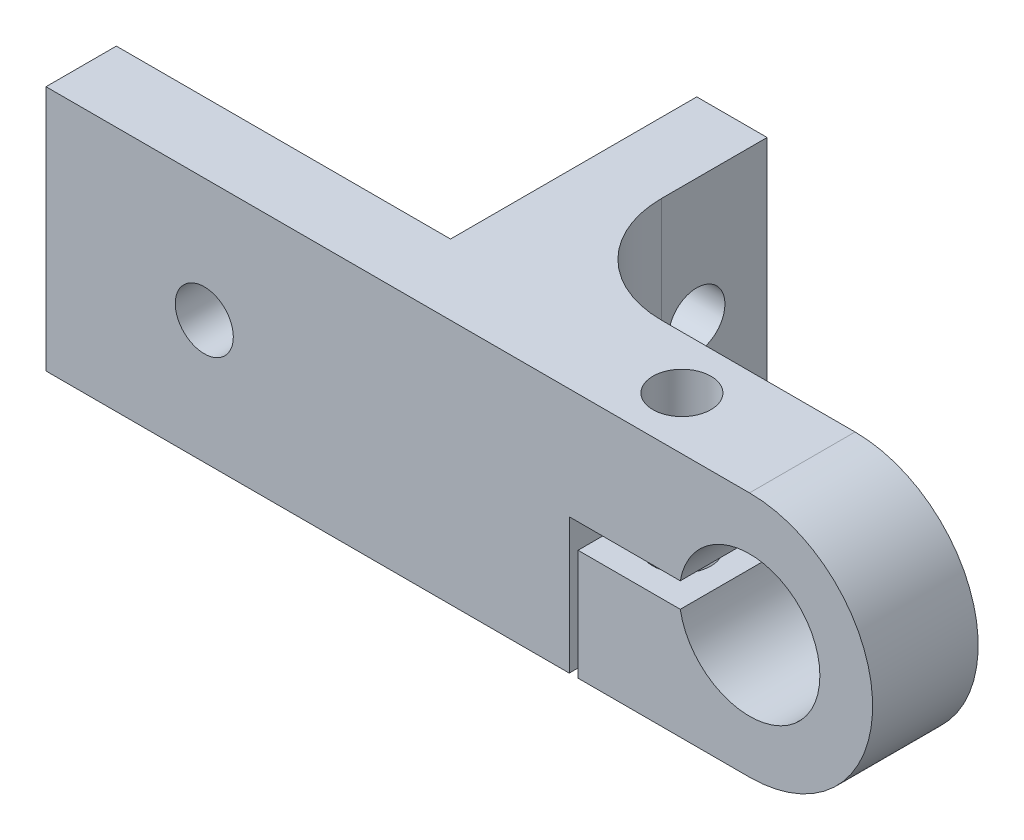
ISO-10303-21;
HEADER;
FILE_DESCRIPTION(('STEP AP214'),'2;1');
FILE_NAME('part.step','',(''),(''),'','','');
FILE_SCHEMA(('AUTOMOTIVE_DESIGN { 1 0 10303 214 1 1 1 1 }'));
ENDSEC;
DATA;
#1=APPLICATION_CONTEXT('core data for automotive mechanical design processes');
#2=APPLICATION_PROTOCOL_DEFINITION('international standard','automotive_design',2000,#1);
#3=PRODUCT_CONTEXT('',#1,'mechanical');
#4=PRODUCT('Part','Part','',(#3));
#5=PRODUCT_RELATED_PRODUCT_CATEGORY('part','',(#4));
#6=PRODUCT_DEFINITION_FORMATION('','',#4);
#7=PRODUCT_DEFINITION_CONTEXT('part definition',#1,'design');
#8=PRODUCT_DEFINITION('design','',#6,#7);
#9=PRODUCT_DEFINITION_SHAPE('','',#8);
#10=(LENGTH_UNIT() NAMED_UNIT(*) SI_UNIT(.MILLI.,.METRE.));
#11=(NAMED_UNIT(*) PLANE_ANGLE_UNIT() SI_UNIT($,.RADIAN.));
#12=(NAMED_UNIT(*) SI_UNIT($,.STERADIAN.) SOLID_ANGLE_UNIT());
#13=UNCERTAINTY_MEASURE_WITH_UNIT(LENGTH_MEASURE(1.E-05),#10,'distance_accuracy_value','');
#14=(GEOMETRIC_REPRESENTATION_CONTEXT(3) GLOBAL_UNCERTAINTY_ASSIGNED_CONTEXT((#13)) GLOBAL_UNIT_ASSIGNED_CONTEXT((#10,
#11,#12)) REPRESENTATION_CONTEXT('',''));
#15=CARTESIAN_POINT('',(0.,0.,0.));
#16=DIRECTION('',(0.,0.,1.));
#17=DIRECTION('',(1.,0.,0.));
#18=AXIS2_PLACEMENT_3D('',#15,#16,#17);
#19=CARTESIAN_POINT('',(0.,0.,18.));
#20=DIRECTION('',(0.,0.,1.));
#21=DIRECTION('',(1.,0.,0.));
#22=AXIS2_PLACEMENT_3D('',#19,#20,#21);
#23=PLANE('',#22);
#24=CARTESIAN_POINT('',(0.,0.,18.));
#25=DIRECTION('',(0.,0.,1.));
#26=DIRECTION('',(1.,0.,0.));
#27=AXIS2_PLACEMENT_3D('',#24,#25,#26);
#28=CIRCLE('',#27,7.);
#29=CARTESIAN_POINT('',(0.,-7.,18.));
#30=VERTEX_POINT('',#29);
#31=CARTESIAN_POINT('',(0.,7.,18.));
#32=VERTEX_POINT('',#31);
#33=EDGE_CURVE('E143',#30,#32,#28,.T.);
#34=ORIENTED_EDGE('',*,*,#33,.T.);
#35=DIRECTION('',(-1.,0.,0.));
#36=VECTOR('',#35,1.);
#37=CARTESIAN_POINT('',(0.,7.,18.));
#38=LINE('',#37,#36);
#39=CARTESIAN_POINT('',(-40.,7.,18.));
#40=VERTEX_POINT('',#39);
#41=EDGE_CURVE('E171',#32,#40,#38,.T.);
#42=ORIENTED_EDGE('',*,*,#41,.T.);
#43=DIRECTION('',(0.,-1.,0.));
#44=VECTOR('',#43,1.);
#45=CARTESIAN_POINT('',(-40.,7.,18.));
#46=LINE('',#45,#44);
#47=CARTESIAN_POINT('',(-40.,-7.,18.));
#48=VERTEX_POINT('',#47);
#49=EDGE_CURVE('E168',#40,#48,#46,.T.);
#50=ORIENTED_EDGE('',*,*,#49,.T.);
#51=DIRECTION('',(1.,0.,0.));
#52=VECTOR('',#51,1.);
#53=CARTESIAN_POINT('',(-40.,-7.,18.));
#54=LINE('',#53,#52);
#55=CARTESIAN_POINT('',(-10.25,-7.,18.));
#56=VERTEX_POINT('',#55);
#57=EDGE_CURVE('E165',#48,#56,#54,.T.);
#58=ORIENTED_EDGE('',*,*,#57,.T.);
#59=DIRECTION('',(0.,1.,0.));
#60=VECTOR('',#59,1.);
#61=CARTESIAN_POINT('',(-10.25,0.699999999999999,18.));
#62=LINE('',#61,#60);
#63=CARTESIAN_POINT('',(-10.25,0.699999999999999,18.));
#64=VERTEX_POINT('',#63);
#65=EDGE_CURVE('E162',#56,#64,#62,.T.);
#66=ORIENTED_EDGE('',*,*,#65,.T.);
#67=DIRECTION('',(1.,0.,0.));
#68=VECTOR('',#67,1.);
#69=CARTESIAN_POINT('',(-3.93827373350304,0.7,18.));
#70=LINE('',#69,#68);
#71=CARTESIAN_POINT('',(-3.93827373350304,0.7,18.));
#72=VERTEX_POINT('',#71);
#73=EDGE_CURVE('E159',#64,#72,#70,.T.);
#74=ORIENTED_EDGE('',*,*,#73,.T.);
#75=CARTESIAN_POINT('',(0.,0.,18.));
#76=DIRECTION('',(0.,0.,-1.));
#77=DIRECTION('',(1.,0.,0.));
#78=AXIS2_PLACEMENT_3D('',#75,#76,#77);
#79=CIRCLE('',#78,4.);
#80=CARTESIAN_POINT('',(-3.93827373350304,-0.7,18.));
#81=VERTEX_POINT('',#80);
#82=EDGE_CURVE('E156',#72,#81,#79,.T.);
#83=ORIENTED_EDGE('',*,*,#82,.T.);
#84=DIRECTION('',(-1.,0.,0.));
#85=VECTOR('',#84,1.);
#86=CARTESIAN_POINT('',(-3.93827373350304,-0.7,18.));
#87=LINE('',#86,#85);
#88=CARTESIAN_POINT('',(-9.75,-0.700000000000001,18.));
#89=VERTEX_POINT('',#88);
#90=EDGE_CURVE('E153',#81,#89,#87,.T.);
#91=ORIENTED_EDGE('',*,*,#90,.T.);
#92=DIRECTION('',(0.,-1.,0.));
#93=VECTOR('',#92,1.);
#94=CARTESIAN_POINT('',(-9.75,-0.700000000000001,18.));
#95=LINE('',#94,#93);
#96=CARTESIAN_POINT('',(-9.75,-7.,18.));
#97=VERTEX_POINT('',#96);
#98=EDGE_CURVE('E150',#89,#97,#95,.T.);
#99=ORIENTED_EDGE('',*,*,#98,.T.);
#100=DIRECTION('',(1.,0.,0.));
#101=VECTOR('',#100,1.);
#102=CARTESIAN_POINT('',(-9.75,-7.,18.));
#103=LINE('',#102,#101);
#104=EDGE_CURVE('E140',#97,#30,#103,.T.);
#105=ORIENTED_EDGE('',*,*,#104,.T.);
#106=EDGE_LOOP('',(#34,#42,#50,#58,#66,#74,#83,#91,#99,#105));
#107=FACE_BOUND('',#106,.T.);
#108=CARTESIAN_POINT('',(-31.,0.,18.));
#109=DIRECTION('',(0.,0.,1.));
#110=DIRECTION('',(1.,0.,0.));
#111=AXIS2_PLACEMENT_3D('',#108,#109,#110);
#112=CIRCLE('',#111,1.65);
#113=CARTESIAN_POINT('',(-29.35,0.,18.));
#114=VERTEX_POINT('',#113);
#115=EDGE_CURVE('E147',#114,#114,#112,.T.);
#116=ORIENTED_EDGE('',*,*,#115,.F.);
#117=EDGE_LOOP('',(#116));
#118=FACE_BOUND('',#117,.T.);
#119=ADVANCED_FACE('F32',(#107,#118),#23,.T.);
#120=CARTESIAN_POINT('',(0.,0.,0.));
#121=DIRECTION('',(0.,0.,1.));
#122=DIRECTION('',(1.,0.,0.));
#123=AXIS2_PLACEMENT_3D('',#120,#121,#122);
#124=PLANE('',#123);
#125=DIRECTION('',(-1.,0.,0.));
#126=VECTOR('',#125,1.);
#127=CARTESIAN_POINT('',(0.,7.,0.));
#128=LINE('',#127,#126);
#129=CARTESIAN_POINT('',(-17.,7.,0.));
#130=VERTEX_POINT('',#129);
#131=CARTESIAN_POINT('',(-21.,7.,0.));
#132=VERTEX_POINT('',#131);
#133=EDGE_CURVE('E144',#130,#132,#128,.T.);
#134=ORIENTED_EDGE('',*,*,#133,.F.);
#135=DIRECTION('',(0.,-1.,0.));
#136=VECTOR('',#135,1.);
#137=CARTESIAN_POINT('',(-17.,7.,0.));
#138=LINE('',#137,#136);
#139=CARTESIAN_POINT('',(-17.,-7.,0.));
#140=VERTEX_POINT('',#139);
#141=EDGE_CURVE('E103',#130,#140,#138,.T.);
#142=ORIENTED_EDGE('',*,*,#141,.T.);
#143=DIRECTION('',(1.,0.,0.));
#144=VECTOR('',#143,1.);
#145=CARTESIAN_POINT('',(-40.,-7.,0.));
#146=LINE('',#145,#144);
#147=CARTESIAN_POINT('',(-21.,-7.,0.));
#148=VERTEX_POINT('',#147);
#149=EDGE_CURVE('E141',#148,#140,#146,.T.);
#150=ORIENTED_EDGE('',*,*,#149,.F.);
#151=DIRECTION('',(0.,-1.,0.));
#152=VECTOR('',#151,1.);
#153=CARTESIAN_POINT('',(-21.,7.,0.));
#154=LINE('',#153,#152);
#155=EDGE_CURVE('E180',#132,#148,#154,.T.);
#156=ORIENTED_EDGE('',*,*,#155,.F.);
#157=EDGE_LOOP('',(#134,#142,#150,#156));
#158=FACE_BOUND('',#157,.T.);
#159=ADVANCED_FACE('F244',(#158),#124,.F.);
#160=CARTESIAN_POINT('',(0.,0.,18.));
#161=DIRECTION('',(0.,0.,-1.));
#162=DIRECTION('',(-1.,0.,0.));
#163=AXIS2_PLACEMENT_3D('',#160,#161,#162);
#164=CYLINDRICAL_SURFACE('',#163,7.);
#165=CARTESIAN_POINT('',(0.,0.,12.));
#166=DIRECTION('',(0.,0.,1.));
#167=DIRECTION('',(1.,0.,0.));
#168=AXIS2_PLACEMENT_3D('',#165,#166,#167);
#169=CIRCLE('',#168,7.);
#170=CARTESIAN_POINT('',(0.,-7.,12.));
#171=VERTEX_POINT('',#170);
#172=CARTESIAN_POINT('',(0.,7.,12.));
#173=VERTEX_POINT('',#172);
#174=EDGE_CURVE('E51',#171,#173,#169,.T.);
#175=ORIENTED_EDGE('',*,*,#174,.T.);
#176=DIRECTION('',(0.,0.,-1.));
#177=VECTOR('',#176,1.);
#178=CARTESIAN_POINT('',(0.,7.,18.));
#179=LINE('',#178,#177);
#180=EDGE_CURVE('E106',#32,#173,#179,.T.);
#181=ORIENTED_EDGE('',*,*,#180,.F.);
#182=ORIENTED_EDGE('',*,*,#33,.F.);
#183=DIRECTION('',(0.,0.,-1.));
#184=VECTOR('',#183,1.);
#185=CARTESIAN_POINT('',(0.,-7.,18.));
#186=LINE('',#185,#184);
#187=EDGE_CURVE('E137',#30,#171,#186,.T.);
#188=ORIENTED_EDGE('',*,*,#187,.T.);
#189=EDGE_LOOP('',(#175,#181,#182,#188));
#190=FACE_BOUND('',#189,.T.);
#191=ADVANCED_FACE('F34',(#190),#164,.T.);
#192=CARTESIAN_POINT('',(0.,7.,18.));
#193=DIRECTION('',(0.,-1.,0.));
#194=DIRECTION('',(0.,0.,-1.));
#195=AXIS2_PLACEMENT_3D('',#192,#193,#194);
#196=PLANE('',#195);
#197=CARTESIAN_POINT('',(-6.84413686675152,7.,15.));
#198=DIRECTION('',(0.,-1.,0.));
#199=DIRECTION('',(0.,0.,-1.));
#200=AXIS2_PLACEMENT_3D('',#197,#198,#199);
#201=CIRCLE('',#200,1.65);
#202=CARTESIAN_POINT('',(-6.84413686675152,7.,13.35));
#203=VERTEX_POINT('',#202);
#204=EDGE_CURVE('E212',#203,#203,#201,.T.);
#205=ORIENTED_EDGE('',*,*,#204,.T.);
#206=EDGE_LOOP('',(#205));
#207=FACE_BOUND('',#206,.T.);
#208=CARTESIAN_POINT('',(-11.,7.,6.));
#209=DIRECTION('',(0.,-1.,0.));
#210=DIRECTION('',(0.,0.,1.));
#211=AXIS2_PLACEMENT_3D('',#208,#209,#210);
#212=CIRCLE('',#211,6.);
#213=CARTESIAN_POINT('',(-11.,7.,12.));
#214=VERTEX_POINT('',#213);
#215=CARTESIAN_POINT('',(-17.,7.,5.99999999999999));
#216=VERTEX_POINT('',#215);
#217=EDGE_CURVE('E89',#214,#216,#212,.T.);
#218=ORIENTED_EDGE('',*,*,#217,.T.);
#219=DIRECTION('',(0.,0.,-1.));
#220=VECTOR('',#219,1.);
#221=CARTESIAN_POINT('',(-17.,7.,0.));
#222=LINE('',#221,#220);
#223=EDGE_CURVE('E91',#216,#130,#222,.T.);
#224=ORIENTED_EDGE('',*,*,#223,.T.);
#225=ORIENTED_EDGE('',*,*,#133,.T.);
#226=DIRECTION('',(0.,0.,1.));
#227=VECTOR('',#226,1.);
#228=CARTESIAN_POINT('',(-21.,7.,14.));
#229=LINE('',#228,#227);
#230=CARTESIAN_POINT('',(-21.,7.,14.));
#231=VERTEX_POINT('',#230);
#232=EDGE_CURVE('E190',#132,#231,#229,.T.);
#233=ORIENTED_EDGE('',*,*,#232,.T.);
#234=DIRECTION('',(-1.,0.,0.));
#235=VECTOR('',#234,1.);
#236=CARTESIAN_POINT('',(-40.,7.,14.));
#237=LINE('',#236,#235);
#238=CARTESIAN_POINT('',(-40.,7.,14.));
#239=VERTEX_POINT('',#238);
#240=EDGE_CURVE('E183',#231,#239,#237,.T.);
#241=ORIENTED_EDGE('',*,*,#240,.T.);
#242=DIRECTION('',(0.,0.,-1.));
#243=VECTOR('',#242,1.);
#244=CARTESIAN_POINT('',(-40.,7.,18.));
#245=LINE('',#244,#243);
#246=EDGE_CURVE('E114',#40,#239,#245,.T.);
#247=ORIENTED_EDGE('',*,*,#246,.F.);
#248=ORIENTED_EDGE('',*,*,#41,.F.);
#249=ORIENTED_EDGE('',*,*,#180,.T.);
#250=DIRECTION('',(-1.,0.,0.));
#251=VECTOR('',#250,1.);
#252=CARTESIAN_POINT('',(7.,7.,12.));
#253=LINE('',#252,#251);
#254=EDGE_CURVE('E215',#173,#214,#253,.T.);
#255=ORIENTED_EDGE('',*,*,#254,.T.);
#256=EDGE_LOOP('',(#218,#224,#225,#233,#241,#247,#248,#249,#255));
#257=FACE_BOUND('',#256,.T.);
#258=ADVANCED_FACE('F285',(#207,#257),#196,.F.);
#259=CARTESIAN_POINT('',(-40.,7.,18.));
#260=DIRECTION('',(1.,0.,0.));
#261=DIRECTION('',(0.,0.,-1.));
#262=AXIS2_PLACEMENT_3D('',#259,#260,#261);
#263=PLANE('',#262);
#264=ORIENTED_EDGE('',*,*,#246,.T.);
#265=DIRECTION('',(0.,-1.,0.));
#266=VECTOR('',#265,1.);
#267=CARTESIAN_POINT('',(-40.,7.,14.));
#268=LINE('',#267,#266);
#269=CARTESIAN_POINT('',(-40.,-7.,14.));
#270=VERTEX_POINT('',#269);
#271=EDGE_CURVE('E111',#239,#270,#268,.T.);
#272=ORIENTED_EDGE('',*,*,#271,.T.);
#273=DIRECTION('',(0.,0.,-1.));
#274=VECTOR('',#273,1.);
#275=CARTESIAN_POINT('',(-40.,-7.,18.));
#276=LINE('',#275,#274);
#277=EDGE_CURVE('E117',#48,#270,#276,.T.);
#278=ORIENTED_EDGE('',*,*,#277,.F.);
#279=ORIENTED_EDGE('',*,*,#49,.F.);
#280=EDGE_LOOP('',(#264,#272,#278,#279));
#281=FACE_BOUND('',#280,.T.);
#282=ADVANCED_FACE('F283',(#281),#263,.F.);
#283=CARTESIAN_POINT('',(-40.,-7.,18.));
#284=DIRECTION('',(0.,1.,0.));
#285=DIRECTION('',(0.,0.,1.));
#286=AXIS2_PLACEMENT_3D('',#283,#284,#285);
#287=PLANE('',#286);
#288=ORIENTED_EDGE('',*,*,#149,.T.);
#289=DIRECTION('',(0.,0.,1.));
#290=VECTOR('',#289,1.);
#291=CARTESIAN_POINT('',(-17.,-7.,18.));
#292=LINE('',#291,#290);
#293=CARTESIAN_POINT('',(-17.,-7.,5.99999999999999));
#294=VERTEX_POINT('',#293);
#295=EDGE_CURVE('E11',#140,#294,#292,.T.);
#296=ORIENTED_EDGE('',*,*,#295,.T.);
#297=CARTESIAN_POINT('',(-11.,-7.,6.));
#298=DIRECTION('',(0.,-1.,0.));
#299=DIRECTION('',(0.,0.,-1.));
#300=AXIS2_PLACEMENT_3D('',#297,#298,#299);
#301=CIRCLE('',#300,6.);
#302=CARTESIAN_POINT('',(-11.,-7.,12.));
#303=VERTEX_POINT('',#302);
#304=EDGE_CURVE('E42',#294,#303,#301,.F.);
#305=ORIENTED_EDGE('',*,*,#304,.T.);
#306=DIRECTION('',(1.,0.,0.));
#307=VECTOR('',#306,1.);
#308=CARTESIAN_POINT('',(-40.,-7.,12.));
#309=LINE('',#308,#307);
#310=CARTESIAN_POINT('',(-10.25,-7.,12.));
#311=VERTEX_POINT('',#310);
#312=EDGE_CURVE('E72',#303,#311,#309,.T.);
#313=ORIENTED_EDGE('',*,*,#312,.T.);
#314=DIRECTION('',(0.,0.,-1.));
#315=VECTOR('',#314,1.);
#316=CARTESIAN_POINT('',(-10.25,-7.,18.));
#317=LINE('',#316,#315);
#318=EDGE_CURVE('E120',#56,#311,#317,.T.);
#319=ORIENTED_EDGE('',*,*,#318,.F.);
#320=ORIENTED_EDGE('',*,*,#57,.F.);
#321=ORIENTED_EDGE('',*,*,#277,.T.);
#322=DIRECTION('',(1.,0.,0.));
#323=VECTOR('',#322,1.);
#324=CARTESIAN_POINT('',(-40.,-7.,14.));
#325=LINE('',#324,#323);
#326=CARTESIAN_POINT('',(-21.,-7.,14.));
#327=VERTEX_POINT('',#326);
#328=EDGE_CURVE('E110',#270,#327,#325,.T.);
#329=ORIENTED_EDGE('',*,*,#328,.T.);
#330=DIRECTION('',(0.,0.,-1.));
#331=VECTOR('',#330,1.);
#332=CARTESIAN_POINT('',(-21.,-7.,18.));
#333=LINE('',#332,#331);
#334=EDGE_CURVE('E96',#327,#148,#333,.T.);
#335=ORIENTED_EDGE('',*,*,#334,.T.);
#336=EDGE_LOOP('',(#288,#296,#305,#313,#319,#320,#321,#329,#335));
#337=FACE_BOUND('',#336,.T.);
#338=ADVANCED_FACE('F94',(#337),#287,.F.);
#339=CARTESIAN_POINT('',(-10.25,0.699999999999999,18.));
#340=DIRECTION('',(-1.,0.,0.));
#341=DIRECTION('',(0.,-1.,0.));
#342=AXIS2_PLACEMENT_3D('',#339,#340,#341);
#343=PLANE('',#342);
#344=ORIENTED_EDGE('',*,*,#318,.T.);
#345=DIRECTION('',(0.,1.,0.));
#346=VECTOR('',#345,1.);
#347=CARTESIAN_POINT('',(-10.25,0.699999999999999,12.));
#348=LINE('',#347,#346);
#349=CARTESIAN_POINT('',(-10.25,0.699999999999999,12.));
#350=VERTEX_POINT('',#349);
#351=EDGE_CURVE('E80',#311,#350,#348,.T.);
#352=ORIENTED_EDGE('',*,*,#351,.T.);
#353=DIRECTION('',(0.,0.,-1.));
#354=VECTOR('',#353,1.);
#355=CARTESIAN_POINT('',(-10.25,0.699999999999999,18.));
#356=LINE('',#355,#354);
#357=EDGE_CURVE('E122',#64,#350,#356,.T.);
#358=ORIENTED_EDGE('',*,*,#357,.F.);
#359=ORIENTED_EDGE('',*,*,#65,.F.);
#360=EDGE_LOOP('',(#344,#352,#358,#359));
#361=FACE_BOUND('',#360,.T.);
#362=ADVANCED_FACE('F276',(#361),#343,.F.);
#363=CARTESIAN_POINT('',(-3.93827373350304,0.7,18.));
#364=DIRECTION('',(0.,1.,0.));
#365=DIRECTION('',(-1.,0.,0.));
#366=AXIS2_PLACEMENT_3D('',#363,#364,#365);
#367=PLANE('',#366);
#368=CARTESIAN_POINT('',(-6.84413686675152,0.7,15.));
#369=DIRECTION('',(0.,1.,0.));
#370=DIRECTION('',(-1.,0.,0.));
#371=AXIS2_PLACEMENT_3D('',#368,#369,#370);
#372=CIRCLE('',#371,1.65);
#373=CARTESIAN_POINT('',(-8.49413686675152,0.7,15.));
#374=VERTEX_POINT('',#373);
#375=EDGE_CURVE('E207',#374,#374,#372,.T.);
#376=ORIENTED_EDGE('',*,*,#375,.T.);
#377=EDGE_LOOP('',(#376));
#378=FACE_BOUND('',#377,.T.);
#379=ORIENTED_EDGE('',*,*,#357,.T.);
#380=DIRECTION('',(1.,0.,0.));
#381=VECTOR('',#380,1.);
#382=CARTESIAN_POINT('',(-3.93827373350304,0.7,12.));
#383=LINE('',#382,#381);
#384=CARTESIAN_POINT('',(-3.93827373350304,0.7,12.));
#385=VERTEX_POINT('',#384);
#386=EDGE_CURVE('E195',#350,#385,#383,.T.);
#387=ORIENTED_EDGE('',*,*,#386,.T.);
#388=DIRECTION('',(0.,0.,-1.));
#389=VECTOR('',#388,1.);
#390=CARTESIAN_POINT('',(-3.93827373350304,0.7,18.));
#391=LINE('',#390,#389);
#392=EDGE_CURVE('E125',#72,#385,#391,.T.);
#393=ORIENTED_EDGE('',*,*,#392,.F.);
#394=ORIENTED_EDGE('',*,*,#73,.F.);
#395=EDGE_LOOP('',(#379,#387,#393,#394));
#396=FACE_BOUND('',#395,.T.);
#397=ADVANCED_FACE('F272',(#378,#396),#367,.F.);
#398=CARTESIAN_POINT('',(0.,0.,18.));
#399=DIRECTION('',(0.,0.,-1.));
#400=DIRECTION('',(-1.,0.,0.));
#401=AXIS2_PLACEMENT_3D('',#398,#399,#400);
#402=CYLINDRICAL_SURFACE('',#401,4.);
#403=ORIENTED_EDGE('',*,*,#392,.T.);
#404=CARTESIAN_POINT('',(0.,0.,12.));
#405=DIRECTION('',(0.,0.,1.));
#406=DIRECTION('',(1.,0.,0.));
#407=AXIS2_PLACEMENT_3D('',#404,#405,#406);
#408=CIRCLE('',#407,4.);
#409=CARTESIAN_POINT('',(-3.93827373350304,-0.7,12.));
#410=VERTEX_POINT('',#409);
#411=EDGE_CURVE('E198',#385,#410,#408,.F.);
#412=ORIENTED_EDGE('',*,*,#411,.T.);
#413=DIRECTION('',(0.,0.,-1.));
#414=VECTOR('',#413,1.);
#415=CARTESIAN_POINT('',(-3.93827373350304,-0.7,18.));
#416=LINE('',#415,#414);
#417=EDGE_CURVE('E128',#81,#410,#416,.T.);
#418=ORIENTED_EDGE('',*,*,#417,.F.);
#419=ORIENTED_EDGE('',*,*,#82,.F.);
#420=EDGE_LOOP('',(#403,#412,#418,#419));
#421=FACE_BOUND('',#420,.T.);
#422=ADVANCED_FACE('F268',(#421),#402,.F.);
#423=CARTESIAN_POINT('',(-3.93827373350304,-0.7,18.));
#424=DIRECTION('',(0.,-1.,0.));
#425=DIRECTION('',(1.,0.,0.));
#426=AXIS2_PLACEMENT_3D('',#423,#424,#425);
#427=PLANE('',#426);
#428=CARTESIAN_POINT('',(-6.84413686675152,-0.7,15.));
#429=DIRECTION('',(0.,-1.,0.));
#430=DIRECTION('',(1.,0.,0.));
#431=AXIS2_PLACEMENT_3D('',#428,#429,#430);
#432=CIRCLE('',#431,1.65);
#433=CARTESIAN_POINT('',(-5.19413686675152,-0.7,15.));
#434=VERTEX_POINT('',#433);
#435=EDGE_CURVE('E102',#434,#434,#432,.T.);
#436=ORIENTED_EDGE('',*,*,#435,.T.);
#437=EDGE_LOOP('',(#436));
#438=FACE_BOUND('',#437,.T.);
#439=ORIENTED_EDGE('',*,*,#417,.T.);
#440=DIRECTION('',(-1.,0.,0.));
#441=VECTOR('',#440,1.);
#442=CARTESIAN_POINT('',(-3.93827373350304,-0.7,12.));
#443=LINE('',#442,#441);
#444=CARTESIAN_POINT('',(-9.75,-0.700000000000001,12.));
#445=VERTEX_POINT('',#444);
#446=EDGE_CURVE('E201',#410,#445,#443,.T.);
#447=ORIENTED_EDGE('',*,*,#446,.T.);
#448=DIRECTION('',(0.,0.,-1.));
#449=VECTOR('',#448,1.);
#450=CARTESIAN_POINT('',(-9.75,-0.700000000000001,18.));
#451=LINE('',#450,#449);
#452=EDGE_CURVE('E131',#89,#445,#451,.T.);
#453=ORIENTED_EDGE('',*,*,#452,.F.);
#454=ORIENTED_EDGE('',*,*,#90,.F.);
#455=EDGE_LOOP('',(#439,#447,#453,#454));
#456=FACE_BOUND('',#455,.T.);
#457=ADVANCED_FACE('F264',(#438,#456),#427,.F.);
#458=CARTESIAN_POINT('',(-9.75,-0.700000000000001,18.));
#459=DIRECTION('',(1.,0.,0.));
#460=DIRECTION('',(0.,0.,-1.));
#461=AXIS2_PLACEMENT_3D('',#458,#459,#460);
#462=PLANE('',#461);
#463=ORIENTED_EDGE('',*,*,#452,.T.);
#464=DIRECTION('',(0.,-1.,0.));
#465=VECTOR('',#464,1.);
#466=CARTESIAN_POINT('',(-9.75,-0.700000000000001,12.));
#467=LINE('',#466,#465);
#468=CARTESIAN_POINT('',(-9.75,-7.,12.));
#469=VERTEX_POINT('',#468);
#470=EDGE_CURVE('E204',#445,#469,#467,.T.);
#471=ORIENTED_EDGE('',*,*,#470,.T.);
#472=DIRECTION('',(0.,0.,-1.));
#473=VECTOR('',#472,1.);
#474=CARTESIAN_POINT('',(-9.75,-7.,18.));
#475=LINE('',#474,#473);
#476=EDGE_CURVE('E134',#97,#469,#475,.T.);
#477=ORIENTED_EDGE('',*,*,#476,.F.);
#478=ORIENTED_EDGE('',*,*,#98,.F.);
#479=EDGE_LOOP('',(#463,#471,#477,#478));
#480=FACE_BOUND('',#479,.T.);
#481=ADVANCED_FACE('F260',(#480),#462,.F.);
#482=CARTESIAN_POINT('',(-9.75,-7.,18.));
#483=DIRECTION('',(0.,1.,0.));
#484=DIRECTION('',(0.,0.,1.));
#485=AXIS2_PLACEMENT_3D('',#482,#483,#484);
#486=PLANE('',#485);
#487=CARTESIAN_POINT('',(-6.84413686675152,-7.,15.));
#488=DIRECTION('',(0.,1.,0.));
#489=DIRECTION('',(0.,0.,1.));
#490=AXIS2_PLACEMENT_3D('',#487,#488,#489);
#491=CIRCLE('',#490,1.65);
#492=CARTESIAN_POINT('',(-6.84413686675152,-7.,16.65));
#493=VERTEX_POINT('',#492);
#494=EDGE_CURVE('E99',#493,#493,#491,.T.);
#495=ORIENTED_EDGE('',*,*,#494,.T.);
#496=EDGE_LOOP('',(#495));
#497=FACE_BOUND('',#496,.T.);
#498=ORIENTED_EDGE('',*,*,#476,.T.);
#499=DIRECTION('',(1.,0.,0.));
#500=VECTOR('',#499,1.);
#501=CARTESIAN_POINT('',(-9.75,-7.,12.));
#502=LINE('',#501,#500);
#503=EDGE_CURVE('E95',#469,#171,#502,.T.);
#504=ORIENTED_EDGE('',*,*,#503,.T.);
#505=ORIENTED_EDGE('',*,*,#187,.F.);
#506=ORIENTED_EDGE('',*,*,#104,.F.);
#507=EDGE_LOOP('',(#498,#504,#505,#506));
#508=FACE_BOUND('',#507,.T.);
#509=ADVANCED_FACE('F257',(#497,#508),#486,.F.);
#510=CARTESIAN_POINT('',(-31.,0.,18.));
#511=DIRECTION('',(0.,0.,-1.));
#512=DIRECTION('',(-1.,0.,0.));
#513=AXIS2_PLACEMENT_3D('',#510,#511,#512);
#514=CYLINDRICAL_SURFACE('',#513,1.65);
#515=CARTESIAN_POINT('',(-31.,0.,14.));
#516=DIRECTION('',(0.,0.,1.));
#517=DIRECTION('',(1.,0.,0.));
#518=AXIS2_PLACEMENT_3D('',#515,#516,#517);
#519=CIRCLE('',#518,1.65);
#520=CARTESIAN_POINT('',(-29.35,0.,14.));
#521=VERTEX_POINT('',#520);
#522=EDGE_CURVE('E107',#521,#521,#519,.T.);
#523=ORIENTED_EDGE('',*,*,#522,.F.);
#524=EDGE_LOOP('',(#523));
#525=FACE_BOUND('',#524,.T.);
#526=ORIENTED_EDGE('',*,*,#115,.T.);
#527=EDGE_LOOP('',(#526));
#528=FACE_BOUND('',#527,.T.);
#529=ADVANCED_FACE('F254',(#525,#528),#514,.F.);
#530=CARTESIAN_POINT('',(-21.,7.,14.));
#531=DIRECTION('',(1.,0.,0.));
#532=DIRECTION('',(0.,0.,-1.));
#533=AXIS2_PLACEMENT_3D('',#530,#531,#532);
#534=PLANE('',#533);
#535=CARTESIAN_POINT('',(-21.,0.,3.99999999999999));
#536=DIRECTION('',(-1.,0.,0.));
#537=DIRECTION('',(0.,0.,1.));
#538=AXIS2_PLACEMENT_3D('',#535,#536,#537);
#539=CIRCLE('',#538,1.6);
#540=CARTESIAN_POINT('',(-21.,0.,5.59999999999999));
#541=VERTEX_POINT('',#540);
#542=EDGE_CURVE('E223',#541,#541,#539,.T.);
#543=ORIENTED_EDGE('',*,*,#542,.F.);
#544=EDGE_LOOP('',(#543));
#545=FACE_BOUND('',#544,.T.);
#546=DIRECTION('',(0.,-1.,0.));
#547=VECTOR('',#546,1.);
#548=CARTESIAN_POINT('',(-21.,7.,14.));
#549=LINE('',#548,#547);
#550=EDGE_CURVE('E182',#231,#327,#549,.T.);
#551=ORIENTED_EDGE('',*,*,#550,.F.);
#552=ORIENTED_EDGE('',*,*,#232,.F.);
#553=ORIENTED_EDGE('',*,*,#155,.T.);
#554=ORIENTED_EDGE('',*,*,#334,.F.);
#555=EDGE_LOOP('',(#551,#552,#553,#554));
#556=FACE_BOUND('',#555,.T.);
#557=ADVANCED_FACE('F378',(#545,#556),#534,.F.);
#558=CARTESIAN_POINT('',(-40.,7.,14.));
#559=DIRECTION('',(0.,0.,1.));
#560=DIRECTION('',(1.,0.,0.));
#561=AXIS2_PLACEMENT_3D('',#558,#559,#560);
#562=PLANE('',#561);
#563=ORIENTED_EDGE('',*,*,#522,.T.);
#564=EDGE_LOOP('',(#563));
#565=FACE_BOUND('',#564,.T.);
#566=ORIENTED_EDGE('',*,*,#271,.F.);
#567=ORIENTED_EDGE('',*,*,#240,.F.);
#568=ORIENTED_EDGE('',*,*,#550,.T.);
#569=ORIENTED_EDGE('',*,*,#328,.F.);
#570=EDGE_LOOP('',(#566,#567,#568,#569));
#571=FACE_BOUND('',#570,.T.);
#572=ADVANCED_FACE('F374',(#565,#571),#562,.F.);
#573=CARTESIAN_POINT('',(-6.84413686675152,7.,15.));
#574=DIRECTION('',(0.,-1.,0.));
#575=DIRECTION('',(0.,0.,-1.));
#576=AXIS2_PLACEMENT_3D('',#573,#574,#575);
#577=CYLINDRICAL_SURFACE('',#576,1.65);
#578=ORIENTED_EDGE('',*,*,#494,.F.);
#579=EDGE_LOOP('',(#578));
#580=FACE_BOUND('',#579,.T.);
#581=ORIENTED_EDGE('',*,*,#435,.F.);
#582=EDGE_LOOP('',(#581));
#583=FACE_BOUND('',#582,.T.);
#584=ADVANCED_FACE('F241',(#580,#583),#577,.F.);
#585=CARTESIAN_POINT('',(-17.,7.,0.));
#586=DIRECTION('',(-1.,0.,0.));
#587=DIRECTION('',(0.,0.,1.));
#588=AXIS2_PLACEMENT_3D('',#585,#586,#587);
#589=PLANE('',#588);
#590=CARTESIAN_POINT('',(-17.,0.,3.99999999999999));
#591=DIRECTION('',(-1.,0.,0.));
#592=DIRECTION('',(0.,0.,1.));
#593=AXIS2_PLACEMENT_3D('',#590,#591,#592);
#594=CIRCLE('',#593,1.6);
#595=CARTESIAN_POINT('',(-17.,0.,5.59999999999999));
#596=VERTEX_POINT('',#595);
#597=EDGE_CURVE('E36',#596,#596,#594,.T.);
#598=ORIENTED_EDGE('',*,*,#597,.T.);
#599=EDGE_LOOP('',(#598));
#600=FACE_BOUND('',#599,.T.);
#601=ORIENTED_EDGE('',*,*,#141,.F.);
#602=ORIENTED_EDGE('',*,*,#223,.F.);
#603=DIRECTION('',(0.,-1.,0.));
#604=VECTOR('',#603,1.);
#605=CARTESIAN_POINT('',(-17.,7.,5.99999999999999));
#606=LINE('',#605,#604);
#607=EDGE_CURVE('E64',#216,#294,#606,.T.);
#608=ORIENTED_EDGE('',*,*,#607,.T.);
#609=ORIENTED_EDGE('',*,*,#295,.F.);
#610=EDGE_LOOP('',(#601,#602,#608,#609));
#611=FACE_BOUND('',#610,.T.);
#612=ADVANCED_FACE('F230',(#600,#611),#589,.F.);
#613=CARTESIAN_POINT('',(-11.,7.,6.));
#614=DIRECTION('',(0.,-1.,0.));
#615=DIRECTION('',(0.,0.,-1.));
#616=AXIS2_PLACEMENT_3D('',#613,#614,#615);
#617=CYLINDRICAL_SURFACE('',#616,6.);
#618=ORIENTED_EDGE('',*,*,#607,.F.);
#619=ORIENTED_EDGE('',*,*,#217,.F.);
#620=DIRECTION('',(0.,-1.,0.));
#621=VECTOR('',#620,1.);
#622=CARTESIAN_POINT('',(-11.,7.,12.));
#623=LINE('',#622,#621);
#624=EDGE_CURVE('E75',#214,#303,#623,.T.);
#625=ORIENTED_EDGE('',*,*,#624,.T.);
#626=ORIENTED_EDGE('',*,*,#304,.F.);
#627=EDGE_LOOP('',(#618,#619,#625,#626));
#628=FACE_BOUND('',#627,.T.);
#629=ADVANCED_FACE('F87',(#628),#617,.F.);
#630=CARTESIAN_POINT('',(7.,7.,12.));
#631=DIRECTION('',(0.,0.,1.));
#632=DIRECTION('',(1.,0.,0.));
#633=AXIS2_PLACEMENT_3D('',#630,#631,#632);
#634=PLANE('',#633);
#635=ORIENTED_EDGE('',*,*,#174,.F.);
#636=ORIENTED_EDGE('',*,*,#503,.F.);
#637=ORIENTED_EDGE('',*,*,#470,.F.);
#638=ORIENTED_EDGE('',*,*,#446,.F.);
#639=ORIENTED_EDGE('',*,*,#411,.F.);
#640=ORIENTED_EDGE('',*,*,#386,.F.);
#641=ORIENTED_EDGE('',*,*,#351,.F.);
#642=ORIENTED_EDGE('',*,*,#312,.F.);
#643=ORIENTED_EDGE('',*,*,#624,.F.);
#644=ORIENTED_EDGE('',*,*,#254,.F.);
#645=EDGE_LOOP('',(#635,#636,#637,#638,#639,#640,#641,#642,#643,#644));
#646=FACE_BOUND('',#645,.T.);
#647=ADVANCED_FACE('F74',(#646),#634,.F.);
#648=ORIENTED_EDGE('',*,*,#204,.F.);
#649=EDGE_LOOP('',(#648));
#650=FACE_BOUND('',#649,.T.);
#651=ORIENTED_EDGE('',*,*,#375,.F.);
#652=EDGE_LOOP('',(#651));
#653=FACE_BOUND('',#652,.T.);
#654=ADVANCED_FACE('F234',(#650,#653),#577,.F.);
#655=CARTESIAN_POINT('',(-3.,0.,3.99999999999999));
#656=DIRECTION('',(-1.,0.,0.));
#657=DIRECTION('',(0.,0.,1.));
#658=AXIS2_PLACEMENT_3D('',#655,#656,#657);
#659=CYLINDRICAL_SURFACE('',#658,1.6);
#660=ORIENTED_EDGE('',*,*,#542,.T.);
#661=EDGE_LOOP('',(#660));
#662=FACE_BOUND('',#661,.T.);
#663=ORIENTED_EDGE('',*,*,#597,.F.);
#664=EDGE_LOOP('',(#663));
#665=FACE_BOUND('',#664,.T.);
#666=ADVANCED_FACE('F232',(#662,#665),#659,.F.);
#667=CLOSED_SHELL('',(#119,#159,#191,#258,#282,#338,#362,#397,#422,#457,#481,#509,#529,#557,
#572,#584,#612,#629,#647,#654,#666));
#668=MANIFOLD_SOLID_BREP('B2',#667);
#669=ADVANCED_BREP_SHAPE_REPRESENTATION('',(#18,#668),#14);
#670=SHAPE_DEFINITION_REPRESENTATION(#9,#669);
ENDSEC;
END-ISO-10303-21;
